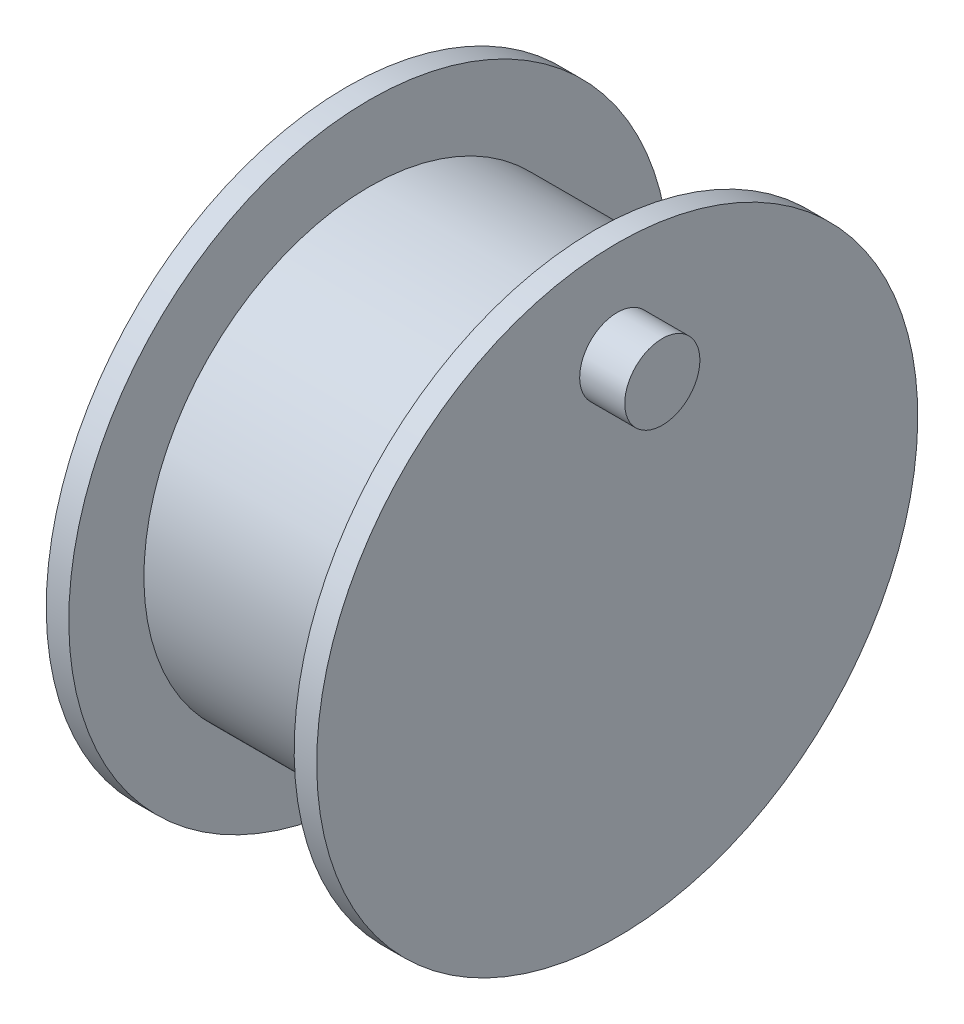
ISO-10303-21;
HEADER;
FILE_DESCRIPTION(('STEP AP214'),'2;1');
FILE_NAME('part.step','',(''),(''),'','','');
FILE_SCHEMA(('AUTOMOTIVE_DESIGN { 1 0 10303 214 1 1 1 1 }'));
ENDSEC;
DATA;
#1=APPLICATION_CONTEXT('core data for automotive mechanical design processes');
#2=APPLICATION_PROTOCOL_DEFINITION('international standard','automotive_design',2000,#1);
#3=PRODUCT_CONTEXT('',#1,'mechanical');
#4=PRODUCT('Part','Part','',(#3));
#5=PRODUCT_RELATED_PRODUCT_CATEGORY('part','',(#4));
#6=PRODUCT_DEFINITION_FORMATION('','',#4);
#7=PRODUCT_DEFINITION_CONTEXT('part definition',#1,'design');
#8=PRODUCT_DEFINITION('design','',#6,#7);
#9=PRODUCT_DEFINITION_SHAPE('','',#8);
#10=(LENGTH_UNIT() NAMED_UNIT(*) SI_UNIT(.MILLI.,.METRE.));
#11=(NAMED_UNIT(*) PLANE_ANGLE_UNIT() SI_UNIT($,.RADIAN.));
#12=(NAMED_UNIT(*) SI_UNIT($,.STERADIAN.) SOLID_ANGLE_UNIT());
#13=UNCERTAINTY_MEASURE_WITH_UNIT(LENGTH_MEASURE(1.E-05),#10,'distance_accuracy_value','');
#14=(GEOMETRIC_REPRESENTATION_CONTEXT(3) GLOBAL_UNCERTAINTY_ASSIGNED_CONTEXT((#13)) GLOBAL_UNIT_ASSIGNED_CONTEXT((#10,
#11,#12)) REPRESENTATION_CONTEXT('',''));
#15=CARTESIAN_POINT('',(0.,0.,0.));
#16=DIRECTION('',(0.,0.,1.));
#17=DIRECTION('',(1.,0.,0.));
#18=AXIS2_PLACEMENT_3D('',#15,#16,#17);
#19=CARTESIAN_POINT('',(7.5,15.,0.));
#20=DIRECTION('',(-1.,0.,0.));
#21=DIRECTION('',(0.,-1.,0.));
#22=AXIS2_PLACEMENT_3D('',#19,#20,#21);
#23=PLANE('',#22);
#24=CARTESIAN_POINT('',(7.5,0.,0.));
#25=DIRECTION('',(1.,0.,0.));
#26=DIRECTION('',(0.,1.,0.));
#27=AXIS2_PLACEMENT_3D('',#24,#25,#26);
#28=CIRCLE('',#27,15.);
#29=CARTESIAN_POINT('',(7.5,15.,0.));
#30=VERTEX_POINT('',#29);
#31=EDGE_CURVE('E82',#30,#30,#28,.T.);
#32=ORIENTED_EDGE('',*,*,#31,.T.);
#33=EDGE_LOOP('',(#32));
#34=FACE_BOUND('',#33,.T.);
#35=CARTESIAN_POINT('',(7.5,0.,0.));
#36=DIRECTION('',(1.,0.,0.));
#37=DIRECTION('',(0.,1.,0.));
#38=AXIS2_PLACEMENT_3D('',#35,#36,#37);
#39=CIRCLE('',#38,20.);
#40=CARTESIAN_POINT('',(7.5,20.,0.));
#41=VERTEX_POINT('',#40);
#42=EDGE_CURVE('E10',#41,#41,#39,.T.);
#43=ORIENTED_EDGE('',*,*,#42,.F.);
#44=EDGE_LOOP('',(#43));
#45=FACE_BOUND('',#44,.T.);
#46=ADVANCED_FACE('F53',(#34,#45),#23,.T.);
#47=CARTESIAN_POINT('',(9.,0.,0.));
#48=DIRECTION('',(1.,0.,0.));
#49=DIRECTION('',(0.,1.,0.));
#50=AXIS2_PLACEMENT_3D('',#47,#48,#49);
#51=CYLINDRICAL_SURFACE('',#50,20.);
#52=ORIENTED_EDGE('',*,*,#42,.T.);
#53=EDGE_LOOP('',(#52));
#54=FACE_BOUND('',#53,.T.);
#55=CARTESIAN_POINT('',(9.,0.,0.));
#56=DIRECTION('',(1.,0.,0.));
#57=DIRECTION('',(0.,1.,0.));
#58=AXIS2_PLACEMENT_3D('',#55,#56,#57);
#59=CIRCLE('',#58,20.);
#60=CARTESIAN_POINT('',(9.,20.,0.));
#61=VERTEX_POINT('',#60);
#62=EDGE_CURVE('E60',#61,#61,#59,.T.);
#63=ORIENTED_EDGE('',*,*,#62,.F.);
#64=EDGE_LOOP('',(#63));
#65=FACE_BOUND('',#64,.T.);
#66=ADVANCED_FACE('F141',(#54,#65),#51,.T.);
#67=CARTESIAN_POINT('',(9.,20.,0.));
#68=DIRECTION('',(1.,0.,0.));
#69=DIRECTION('',(0.,1.,0.));
#70=AXIS2_PLACEMENT_3D('',#67,#68,#69);
#71=PLANE('',#70);
#72=CARTESIAN_POINT('',(9.,13.5,0.));
#73=DIRECTION('',(1.,0.,0.));
#74=DIRECTION('',(0.,1.,0.));
#75=AXIS2_PLACEMENT_3D('',#72,#73,#74);
#76=CIRCLE('',#75,2.5);
#77=CARTESIAN_POINT('',(9.,16.,0.));
#78=VERTEX_POINT('',#77);
#79=EDGE_CURVE('E87',#78,#78,#76,.T.);
#80=ORIENTED_EDGE('',*,*,#79,.F.);
#81=EDGE_LOOP('',(#80));
#82=FACE_BOUND('',#81,.T.);
#83=ORIENTED_EDGE('',*,*,#62,.T.);
#84=EDGE_LOOP('',(#83));
#85=FACE_BOUND('',#84,.T.);
#86=ADVANCED_FACE('F117',(#82,#85),#71,.T.);
#87=CARTESIAN_POINT('',(-9.,0.,0.));
#88=DIRECTION('',(-1.,0.,0.));
#89=DIRECTION('',(0.,-1.,0.));
#90=AXIS2_PLACEMENT_3D('',#87,#88,#89);
#91=PLANE('',#90);
#92=CARTESIAN_POINT('',(-9.,0.,0.));
#93=DIRECTION('',(-1.,0.,0.));
#94=DIRECTION('',(0.,-1.,0.));
#95=AXIS2_PLACEMENT_3D('',#92,#93,#94);
#96=CIRCLE('',#95,3.);
#97=CARTESIAN_POINT('',(-9.,-3.,0.));
#98=VERTEX_POINT('',#97);
#99=EDGE_CURVE('E95',#98,#98,#96,.T.);
#100=ORIENTED_EDGE('',*,*,#99,.F.);
#101=EDGE_LOOP('',(#100));
#102=FACE_BOUND('',#101,.T.);
#103=CARTESIAN_POINT('',(-9.,0.,0.));
#104=DIRECTION('',(1.,0.,0.));
#105=DIRECTION('',(0.,1.,0.));
#106=AXIS2_PLACEMENT_3D('',#103,#104,#105);
#107=CIRCLE('',#106,20.);
#108=CARTESIAN_POINT('',(-9.,20.,0.));
#109=VERTEX_POINT('',#108);
#110=EDGE_CURVE('E66',#109,#109,#107,.T.);
#111=ORIENTED_EDGE('',*,*,#110,.F.);
#112=EDGE_LOOP('',(#111));
#113=FACE_BOUND('',#112,.T.);
#114=ADVANCED_FACE('F113',(#102,#113),#91,.T.);
#115=CARTESIAN_POINT('',(9.,0.,0.));
#116=DIRECTION('',(1.,0.,0.));
#117=DIRECTION('',(0.,1.,0.));
#118=AXIS2_PLACEMENT_3D('',#115,#116,#117);
#119=CYLINDRICAL_SURFACE('',#118,20.);
#120=ORIENTED_EDGE('',*,*,#110,.T.);
#121=EDGE_LOOP('',(#120));
#122=FACE_BOUND('',#121,.T.);
#123=CARTESIAN_POINT('',(-7.5,0.,0.));
#124=DIRECTION('',(1.,0.,0.));
#125=DIRECTION('',(0.,1.,0.));
#126=AXIS2_PLACEMENT_3D('',#123,#124,#125);
#127=CIRCLE('',#126,20.);
#128=CARTESIAN_POINT('',(-7.5,20.,0.));
#129=VERTEX_POINT('',#128);
#130=EDGE_CURVE('E72',#129,#129,#127,.T.);
#131=ORIENTED_EDGE('',*,*,#130,.F.);
#132=EDGE_LOOP('',(#131));
#133=FACE_BOUND('',#132,.T.);
#134=ADVANCED_FACE('F116',(#122,#133),#119,.T.);
#135=CARTESIAN_POINT('',(-7.5,20.,0.));
#136=DIRECTION('',(1.,0.,0.));
#137=DIRECTION('',(0.,1.,0.));
#138=AXIS2_PLACEMENT_3D('',#135,#136,#137);
#139=PLANE('',#138);
#140=ORIENTED_EDGE('',*,*,#130,.T.);
#141=EDGE_LOOP('',(#140));
#142=FACE_BOUND('',#141,.T.);
#143=CARTESIAN_POINT('',(-7.5,0.,0.));
#144=DIRECTION('',(1.,0.,0.));
#145=DIRECTION('',(0.,1.,0.));
#146=AXIS2_PLACEMENT_3D('',#143,#144,#145);
#147=CIRCLE('',#146,15.);
#148=CARTESIAN_POINT('',(-7.5,15.,0.));
#149=VERTEX_POINT('',#148);
#150=EDGE_CURVE('E78',#149,#149,#147,.T.);
#151=ORIENTED_EDGE('',*,*,#150,.F.);
#152=EDGE_LOOP('',(#151));
#153=FACE_BOUND('',#152,.T.);
#154=ADVANCED_FACE('F123',(#142,#153),#139,.T.);
#155=CARTESIAN_POINT('',(9.,0.,0.));
#156=DIRECTION('',(1.,0.,0.));
#157=DIRECTION('',(0.,1.,0.));
#158=AXIS2_PLACEMENT_3D('',#155,#156,#157);
#159=CYLINDRICAL_SURFACE('',#158,15.);
#160=ORIENTED_EDGE('',*,*,#150,.T.);
#161=EDGE_LOOP('',(#160));
#162=FACE_BOUND('',#161,.T.);
#163=ORIENTED_EDGE('',*,*,#31,.F.);
#164=EDGE_LOOP('',(#163));
#165=FACE_BOUND('',#164,.T.);
#166=ADVANCED_FACE('F129',(#162,#165),#159,.T.);
#167=CARTESIAN_POINT('',(12.,13.5,0.));
#168=DIRECTION('',(-1.,0.,0.));
#169=DIRECTION('',(0.,-1.,0.));
#170=AXIS2_PLACEMENT_3D('',#167,#168,#169);
#171=CYLINDRICAL_SURFACE('',#170,2.5);
#172=CARTESIAN_POINT('',(12.,13.5,0.));
#173=DIRECTION('',(1.,0.,0.));
#174=DIRECTION('',(0.,1.,0.));
#175=AXIS2_PLACEMENT_3D('',#172,#173,#174);
#176=CIRCLE('',#175,2.5);
#177=CARTESIAN_POINT('',(12.,16.,0.));
#178=VERTEX_POINT('',#177);
#179=EDGE_CURVE('E86',#178,#178,#176,.T.);
#180=ORIENTED_EDGE('',*,*,#179,.F.);
#181=EDGE_LOOP('',(#180));
#182=FACE_BOUND('',#181,.T.);
#183=ORIENTED_EDGE('',*,*,#79,.T.);
#184=EDGE_LOOP('',(#183));
#185=FACE_BOUND('',#184,.T.);
#186=ADVANCED_FACE('F135',(#182,#185),#171,.T.);
#187=CARTESIAN_POINT('',(12.,13.5,0.));
#188=DIRECTION('',(1.,0.,0.));
#189=DIRECTION('',(0.,1.,0.));
#190=AXIS2_PLACEMENT_3D('',#187,#188,#189);
#191=PLANE('',#190);
#192=ORIENTED_EDGE('',*,*,#179,.T.);
#193=EDGE_LOOP('',(#192));
#194=FACE_BOUND('',#193,.T.);
#195=ADVANCED_FACE('F109',(#194),#191,.T.);
#196=CARTESIAN_POINT('',(7.,0.,0.));
#197=DIRECTION('',(-1.,0.,0.));
#198=DIRECTION('',(0.,-1.,0.));
#199=AXIS2_PLACEMENT_3D('',#196,#197,#198);
#200=CYLINDRICAL_SURFACE('',#199,3.);
#201=CARTESIAN_POINT('',(7.,0.,0.));
#202=DIRECTION('',(-1.,0.,0.));
#203=DIRECTION('',(0.,-1.,0.));
#204=AXIS2_PLACEMENT_3D('',#201,#202,#203);
#205=CIRCLE('',#204,3.);
#206=CARTESIAN_POINT('',(7.,-3.,0.));
#207=VERTEX_POINT('',#206);
#208=EDGE_CURVE('E91',#207,#207,#205,.T.);
#209=ORIENTED_EDGE('',*,*,#208,.F.);
#210=EDGE_LOOP('',(#209));
#211=FACE_BOUND('',#210,.T.);
#212=ORIENTED_EDGE('',*,*,#99,.T.);
#213=EDGE_LOOP('',(#212));
#214=FACE_BOUND('',#213,.T.);
#215=ADVANCED_FACE('F106',(#211,#214),#200,.F.);
#216=CARTESIAN_POINT('',(7.,0.,0.));
#217=DIRECTION('',(-1.,0.,0.));
#218=DIRECTION('',(0.,-1.,0.));
#219=AXIS2_PLACEMENT_3D('',#216,#217,#218);
#220=PLANE('',#219);
#221=ORIENTED_EDGE('',*,*,#208,.T.);
#222=EDGE_LOOP('',(#221));
#223=FACE_BOUND('',#222,.T.);
#224=ADVANCED_FACE('F104',(#223),#220,.T.);
#225=CLOSED_SHELL('',(#46,#66,#86,#114,#134,#154,#166,#186,#195,#215,#224));
#226=MANIFOLD_SOLID_BREP('B2',#225);
#227=ADVANCED_BREP_SHAPE_REPRESENTATION('',(#18,#226),#14);
#228=SHAPE_DEFINITION_REPRESENTATION(#9,#227);
ENDSEC;
END-ISO-10303-21;
